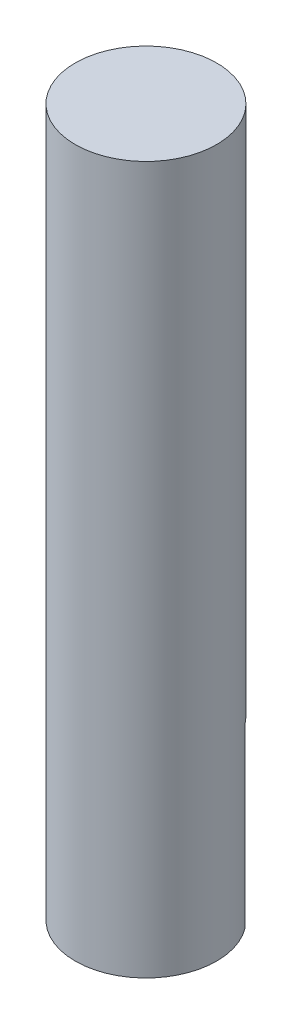
ISO-10303-21;
HEADER;
FILE_DESCRIPTION(('STEP AP214'),'2;1');
FILE_NAME('part.step','',(''),(''),'','','');
FILE_SCHEMA(('AUTOMOTIVE_DESIGN { 1 0 10303 214 1 1 1 1 }'));
ENDSEC;
DATA;
#1=APPLICATION_CONTEXT('core data for automotive mechanical design processes');
#2=APPLICATION_PROTOCOL_DEFINITION('international standard','automotive_design',2000,#1);
#3=PRODUCT_CONTEXT('',#1,'mechanical');
#4=PRODUCT('Part','Part','',(#3));
#5=PRODUCT_RELATED_PRODUCT_CATEGORY('part','',(#4));
#6=PRODUCT_DEFINITION_FORMATION('','',#4);
#7=PRODUCT_DEFINITION_CONTEXT('part definition',#1,'design');
#8=PRODUCT_DEFINITION('design','',#6,#7);
#9=PRODUCT_DEFINITION_SHAPE('','',#8);
#10=(LENGTH_UNIT() NAMED_UNIT(*) SI_UNIT(.MILLI.,.METRE.));
#11=(NAMED_UNIT(*) PLANE_ANGLE_UNIT() SI_UNIT($,.RADIAN.));
#12=(NAMED_UNIT(*) SI_UNIT($,.STERADIAN.) SOLID_ANGLE_UNIT());
#13=UNCERTAINTY_MEASURE_WITH_UNIT(LENGTH_MEASURE(1.E-05),#10,'distance_accuracy_value','');
#14=(GEOMETRIC_REPRESENTATION_CONTEXT(3) GLOBAL_UNCERTAINTY_ASSIGNED_CONTEXT((#13)) GLOBAL_UNIT_ASSIGNED_CONTEXT((#10,
#11,#12)) REPRESENTATION_CONTEXT('',''));
#15=CARTESIAN_POINT('',(0.,0.,0.));
#16=DIRECTION('',(0.,0.,1.));
#17=DIRECTION('',(1.,0.,0.));
#18=AXIS2_PLACEMENT_3D('',#15,#16,#17);
#19=CARTESIAN_POINT('',(0.,50.,0.));
#20=DIRECTION('',(0.,-1.,0.));
#21=DIRECTION('',(0.,0.,-1.));
#22=AXIS2_PLACEMENT_3D('',#19,#20,#21);
#23=CYLINDRICAL_SURFACE('',#22,5.);
#24=CARTESIAN_POINT('',(0.,50.,0.));
#25=DIRECTION('',(0.,1.,0.));
#26=DIRECTION('',(0.,0.,1.));
#27=AXIS2_PLACEMENT_3D('',#24,#25,#26);
#28=CIRCLE('',#27,5.);
#29=CARTESIAN_POINT('',(0.,50.,5.));
#30=VERTEX_POINT('',#29);
#31=EDGE_CURVE('E11',#30,#30,#28,.T.);
#32=ORIENTED_EDGE('',*,*,#31,.F.);
#33=EDGE_LOOP('',(#32));
#34=FACE_BOUND('',#33,.T.);
#35=DIRECTION('',(0.,-1.,0.));
#36=VECTOR('',#35,1.);
#37=CARTESIAN_POINT('',(4.,12.5,-3.));
#38=LINE('',#37,#36);
#39=CARTESIAN_POINT('',(4.,12.5,-3.));
#40=VERTEX_POINT('',#39);
#41=CARTESIAN_POINT('',(4.,0.,-3.));
#42=VERTEX_POINT('',#41);
#43=EDGE_CURVE('E53',#40,#42,#38,.T.);
#44=ORIENTED_EDGE('',*,*,#43,.F.);
#45=CARTESIAN_POINT('',(0.,12.5,0.));
#46=DIRECTION('',(0.,1.,0.));
#47=DIRECTION('',(0.,0.,-1.));
#48=AXIS2_PLACEMENT_3D('',#45,#46,#47);
#49=CIRCLE('',#48,5.00000000000001);
#50=CARTESIAN_POINT('',(-4.,12.5,-3.));
#51=VERTEX_POINT('',#50);
#52=EDGE_CURVE('E71',#40,#51,#49,.T.);
#53=ORIENTED_EDGE('',*,*,#52,.T.);
#54=DIRECTION('',(0.,-1.,0.));
#55=VECTOR('',#54,1.);
#56=CARTESIAN_POINT('',(-4.,12.5,-3.));
#57=LINE('',#56,#55);
#58=CARTESIAN_POINT('',(-4.,0.,-3.));
#59=VERTEX_POINT('',#58);
#60=EDGE_CURVE('E66',#51,#59,#57,.T.);
#61=ORIENTED_EDGE('',*,*,#60,.T.);
#62=CARTESIAN_POINT('',(0.,0.,0.));
#63=DIRECTION('',(0.,1.,0.));
#64=DIRECTION('',(0.,0.,1.));
#65=AXIS2_PLACEMENT_3D('',#62,#63,#64);
#66=CIRCLE('',#65,5.);
#67=EDGE_CURVE('E42',#59,#42,#66,.T.);
#68=ORIENTED_EDGE('',*,*,#67,.T.);
#69=EDGE_LOOP('',(#44,#53,#61,#68));
#70=FACE_BOUND('',#69,.T.);
#71=ADVANCED_FACE('F39',(#34,#70),#23,.T.);
#72=CARTESIAN_POINT('',(0.,0.,0.));
#73=DIRECTION('',(0.,1.,0.));
#74=DIRECTION('',(0.,0.,1.));
#75=AXIS2_PLACEMENT_3D('',#72,#73,#74);
#76=PLANE('',#75);
#77=DIRECTION('',(1.,0.,0.));
#78=VECTOR('',#77,1.);
#79=CARTESIAN_POINT('',(-4.,0.,-3.));
#80=LINE('',#79,#78);
#81=EDGE_CURVE('E63',#59,#42,#80,.T.);
#82=ORIENTED_EDGE('',*,*,#81,.T.);
#83=ORIENTED_EDGE('',*,*,#67,.F.);
#84=EDGE_LOOP('',(#82,#83));
#85=FACE_BOUND('',#84,.T.);
#86=ADVANCED_FACE('F75',(#85),#76,.F.);
#87=CARTESIAN_POINT('',(0.,50.,0.));
#88=DIRECTION('',(0.,1.,0.));
#89=DIRECTION('',(0.,0.,1.));
#90=AXIS2_PLACEMENT_3D('',#87,#88,#89);
#91=PLANE('',#90);
#92=ORIENTED_EDGE('',*,*,#31,.T.);
#93=EDGE_LOOP('',(#92));
#94=FACE_BOUND('',#93,.T.);
#95=ADVANCED_FACE('F77',(#94),#91,.T.);
#96=CARTESIAN_POINT('',(-4.,12.5,-3.));
#97=DIRECTION('',(0.,0.,-1.));
#98=DIRECTION('',(-1.,0.,0.));
#99=AXIS2_PLACEMENT_3D('',#96,#97,#98);
#100=PLANE('',#99);
#101=ORIENTED_EDGE('',*,*,#81,.F.);
#102=ORIENTED_EDGE('',*,*,#60,.F.);
#103=DIRECTION('',(1.,0.,0.));
#104=VECTOR('',#103,1.);
#105=CARTESIAN_POINT('',(-4.,12.5,-3.));
#106=LINE('',#105,#104);
#107=EDGE_CURVE('E59',#51,#40,#106,.T.);
#108=ORIENTED_EDGE('',*,*,#107,.T.);
#109=ORIENTED_EDGE('',*,*,#43,.T.);
#110=EDGE_LOOP('',(#101,#102,#108,#109));
#111=FACE_BOUND('',#110,.T.);
#112=ADVANCED_FACE('F65',(#111),#100,.T.);
#113=CARTESIAN_POINT('',(0.,12.5,0.));
#114=DIRECTION('',(0.,-1.,0.));
#115=DIRECTION('',(0.,0.,-1.));
#116=AXIS2_PLACEMENT_3D('',#113,#114,#115);
#117=PLANE('',#116);
#118=ORIENTED_EDGE('',*,*,#52,.F.);
#119=ORIENTED_EDGE('',*,*,#107,.F.);
#120=EDGE_LOOP('',(#118,#119));
#121=FACE_BOUND('',#120,.T.);
#122=ADVANCED_FACE('F88',(#121),#117,.T.);
#123=CLOSED_SHELL('',(#71,#86,#95,#112,#122));
#124=MANIFOLD_SOLID_BREP('B2',#123);
#125=ADVANCED_BREP_SHAPE_REPRESENTATION('',(#18,#124),#14);
#126=SHAPE_DEFINITION_REPRESENTATION(#9,#125);
ENDSEC;
END-ISO-10303-21;
